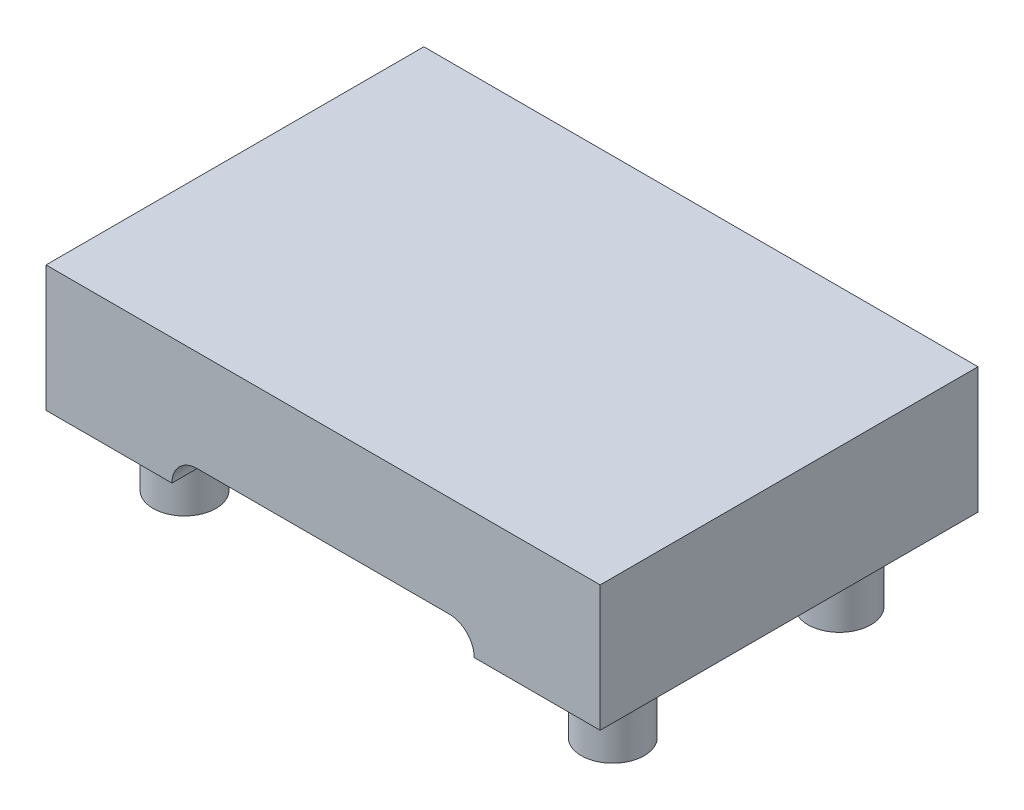
ISO-10303-21;
HEADER;
FILE_DESCRIPTION(('STEP AP214'),'2;1');
FILE_NAME('part.step','',(''),(''),'','','');
FILE_SCHEMA(('AUTOMOTIVE_DESIGN { 1 0 10303 214 1 1 1 1 }'));
ENDSEC;
DATA;
#1=APPLICATION_CONTEXT('core data for automotive mechanical design processes');
#2=APPLICATION_PROTOCOL_DEFINITION('international standard','automotive_design',2000,#1);
#3=PRODUCT_CONTEXT('',#1,'mechanical');
#4=PRODUCT('Part','Part','',(#3));
#5=PRODUCT_RELATED_PRODUCT_CATEGORY('part','',(#4));
#6=PRODUCT_DEFINITION_FORMATION('','',#4);
#7=PRODUCT_DEFINITION_CONTEXT('part definition',#1,'design');
#8=PRODUCT_DEFINITION('design','',#6,#7);
#9=PRODUCT_DEFINITION_SHAPE('','',#8);
#10=(LENGTH_UNIT() NAMED_UNIT(*) SI_UNIT(.MILLI.,.METRE.));
#11=(NAMED_UNIT(*) PLANE_ANGLE_UNIT() SI_UNIT($,.RADIAN.));
#12=(NAMED_UNIT(*) SI_UNIT($,.STERADIAN.) SOLID_ANGLE_UNIT());
#13=UNCERTAINTY_MEASURE_WITH_UNIT(LENGTH_MEASURE(1.E-05),#10,'distance_accuracy_value','');
#14=(GEOMETRIC_REPRESENTATION_CONTEXT(3) GLOBAL_UNCERTAINTY_ASSIGNED_CONTEXT((#13)) GLOBAL_UNIT_ASSIGNED_CONTEXT((#10,
#11,#12)) REPRESENTATION_CONTEXT('',''));
#15=CARTESIAN_POINT('',(0.,0.,0.));
#16=DIRECTION('',(0.,0.,1.));
#17=DIRECTION('',(1.,0.,0.));
#18=AXIS2_PLACEMENT_3D('',#15,#16,#17);
#19=CARTESIAN_POINT('',(9.,0.,-0.00999999999999959));
#20=DIRECTION('',(0.,1.,0.));
#21=DIRECTION('',(0.,0.,1.));
#22=AXIS2_PLACEMENT_3D('',#19,#20,#21);
#23=PLANE('',#22);
#24=CARTESIAN_POINT('',(-8.5,0.,12.));
#25=DIRECTION('',(0.,1.,0.));
#26=DIRECTION('',(0.,0.,1.));
#27=AXIS2_PLACEMENT_3D('',#24,#25,#26);
#28=CIRCLE('',#27,1.25);
#29=CARTESIAN_POINT('',(-8.5,0.,13.25));
#30=VERTEX_POINT('',#29);
#31=EDGE_CURVE('E11',#30,#30,#28,.F.);
#32=ORIENTED_EDGE('',*,*,#31,.F.);
#33=EDGE_LOOP('',(#32));
#34=FACE_BOUND('',#33,.T.);
#35=CARTESIAN_POINT('',(-8.49999999999999,0.,3.));
#36=DIRECTION('',(0.,1.,0.));
#37=DIRECTION('',(0.,0.,1.));
#38=AXIS2_PLACEMENT_3D('',#35,#36,#37);
#39=CIRCLE('',#38,1.25);
#40=CARTESIAN_POINT('',(-8.49999999999999,0.,4.25));
#41=VERTEX_POINT('',#40);
#42=EDGE_CURVE('E44',#41,#41,#39,.F.);
#43=ORIENTED_EDGE('',*,*,#42,.F.);
#44=EDGE_LOOP('',(#43));
#45=FACE_BOUND('',#44,.T.);
#46=DIRECTION('',(0.,0.,-1.));
#47=VECTOR('',#46,1.);
#48=CARTESIAN_POINT('',(-6.,0.,15.));
#49=LINE('',#48,#47);
#50=CARTESIAN_POINT('',(-6.,0.,0.));
#51=VERTEX_POINT('',#50);
#52=CARTESIAN_POINT('',(-6.,0.,15.));
#53=VERTEX_POINT('',#52);
#54=EDGE_CURVE('E175',#51,#53,#49,.F.);
#55=ORIENTED_EDGE('',*,*,#54,.T.);
#56=DIRECTION('',(-1.,0.,0.));
#57=VECTOR('',#56,1.);
#58=CARTESIAN_POINT('',(0.,0.,15.));
#59=LINE('',#58,#57);
#60=CARTESIAN_POINT('',(-11.,0.,15.));
#61=VERTEX_POINT('',#60);
#62=EDGE_CURVE('E176',#53,#61,#59,.T.);
#63=ORIENTED_EDGE('',*,*,#62,.T.);
#64=DIRECTION('',(0.,0.,1.));
#65=VECTOR('',#64,1.);
#66=CARTESIAN_POINT('',(-11.,0.,0.));
#67=LINE('',#66,#65);
#68=CARTESIAN_POINT('',(-11.,0.,0.));
#69=VERTEX_POINT('',#68);
#70=EDGE_CURVE('E109',#69,#61,#67,.T.);
#71=ORIENTED_EDGE('',*,*,#70,.F.);
#72=DIRECTION('',(-1.,0.,0.));
#73=VECTOR('',#72,1.);
#74=CARTESIAN_POINT('',(0.,0.,0.));
#75=LINE('',#74,#73);
#76=EDGE_CURVE('E172',#51,#69,#75,.T.);
#77=ORIENTED_EDGE('',*,*,#76,.F.);
#78=EDGE_LOOP('',(#55,#63,#71,#77));
#79=FACE_BOUND('',#78,.T.);
#80=ADVANCED_FACE('F37',(#34,#45,#79),#23,.F.);
#81=CARTESIAN_POINT('',(8.5,0.,3.));
#82=DIRECTION('',(0.,1.,0.));
#83=DIRECTION('',(0.,0.,1.));
#84=AXIS2_PLACEMENT_3D('',#81,#82,#83);
#85=CIRCLE('',#84,1.25);
#86=CARTESIAN_POINT('',(8.5,0.,4.25));
#87=VERTEX_POINT('',#86);
#88=EDGE_CURVE('E184',#87,#87,#85,.F.);
#89=ORIENTED_EDGE('',*,*,#88,.F.);
#90=EDGE_LOOP('',(#89));
#91=FACE_BOUND('',#90,.T.);
#92=CARTESIAN_POINT('',(8.5,0.,12.));
#93=DIRECTION('',(0.,1.,0.));
#94=DIRECTION('',(0.,0.,1.));
#95=AXIS2_PLACEMENT_3D('',#92,#93,#94);
#96=CIRCLE('',#95,1.25);
#97=CARTESIAN_POINT('',(8.5,0.,13.25));
#98=VERTEX_POINT('',#97);
#99=EDGE_CURVE('E174',#98,#98,#96,.F.);
#100=ORIENTED_EDGE('',*,*,#99,.F.);
#101=EDGE_LOOP('',(#100));
#102=FACE_BOUND('',#101,.T.);
#103=CARTESIAN_POINT('',(11.,0.,0.));
#104=VERTEX_POINT('',#103);
#105=CARTESIAN_POINT('',(6.,0.,0.));
#106=VERTEX_POINT('',#105);
#107=EDGE_CURVE('E51',#104,#106,#75,.T.);
#108=ORIENTED_EDGE('',*,*,#107,.F.);
#109=DIRECTION('',(0.,0.,-1.));
#110=VECTOR('',#109,1.);
#111=CARTESIAN_POINT('',(11.,0.,15.));
#112=LINE('',#111,#110);
#113=CARTESIAN_POINT('',(11.,0.,15.));
#114=VERTEX_POINT('',#113);
#115=EDGE_CURVE('E146',#114,#104,#112,.T.);
#116=ORIENTED_EDGE('',*,*,#115,.F.);
#117=CARTESIAN_POINT('',(6.,0.,15.));
#118=VERTEX_POINT('',#117);
#119=EDGE_CURVE('E178',#114,#118,#59,.T.);
#120=ORIENTED_EDGE('',*,*,#119,.T.);
#121=DIRECTION('',(0.,0.,-1.));
#122=VECTOR('',#121,1.);
#123=CARTESIAN_POINT('',(6.,0.,15.));
#124=LINE('',#123,#122);
#125=EDGE_CURVE('E58',#118,#106,#124,.T.);
#126=ORIENTED_EDGE('',*,*,#125,.T.);
#127=EDGE_LOOP('',(#108,#116,#120,#126));
#128=FACE_BOUND('',#127,.T.);
#129=ADVANCED_FACE('F193',(#91,#102,#128),#23,.F.);
#130=CARTESIAN_POINT('',(0.,0.,15.));
#131=DIRECTION('',(0.,0.,1.));
#132=DIRECTION('',(1.,0.,0.));
#133=AXIS2_PLACEMENT_3D('',#130,#131,#132);
#134=PLANE('',#133);
#135=ORIENTED_EDGE('',*,*,#119,.F.);
#136=DIRECTION('',(0.,-1.,0.));
#137=VECTOR('',#136,1.);
#138=CARTESIAN_POINT('',(11.,2.,15.));
#139=LINE('',#138,#137);
#140=CARTESIAN_POINT('',(11.,5.,15.));
#141=VERTEX_POINT('',#140);
#142=EDGE_CURVE('E111',#141,#114,#139,.T.);
#143=ORIENTED_EDGE('',*,*,#142,.F.);
#144=DIRECTION('',(1.,0.,0.));
#145=VECTOR('',#144,1.);
#146=CARTESIAN_POINT('',(-11.,5.,15.));
#147=LINE('',#146,#145);
#148=CARTESIAN_POINT('',(-11.,5.,15.));
#149=VERTEX_POINT('',#148);
#150=EDGE_CURVE('E114',#149,#141,#147,.T.);
#151=ORIENTED_EDGE('',*,*,#150,.F.);
#152=DIRECTION('',(0.,1.,0.));
#153=VECTOR('',#152,1.);
#154=CARTESIAN_POINT('',(-11.,2.,15.));
#155=LINE('',#154,#153);
#156=EDGE_CURVE('E102',#61,#149,#155,.T.);
#157=ORIENTED_EDGE('',*,*,#156,.F.);
#158=ORIENTED_EDGE('',*,*,#62,.F.);
#159=CARTESIAN_POINT('',(-5.,0.,15.));
#160=DIRECTION('',(0.,0.,1.));
#161=DIRECTION('',(1.,0.,0.));
#162=AXIS2_PLACEMENT_3D('',#159,#160,#161);
#163=CIRCLE('',#162,1.);
#164=CARTESIAN_POINT('',(-5.,1.,15.));
#165=VERTEX_POINT('',#164);
#166=EDGE_CURVE('E152',#165,#53,#163,.T.);
#167=ORIENTED_EDGE('',*,*,#166,.F.);
#168=DIRECTION('',(-1.,0.,0.));
#169=VECTOR('',#168,1.);
#170=CARTESIAN_POINT('',(-5.,1.,15.));
#171=LINE('',#170,#169);
#172=CARTESIAN_POINT('',(5.,1.,15.));
#173=VERTEX_POINT('',#172);
#174=EDGE_CURVE('E158',#173,#165,#171,.T.);
#175=ORIENTED_EDGE('',*,*,#174,.F.);
#176=CARTESIAN_POINT('',(5.,0.,15.));
#177=DIRECTION('',(0.,0.,1.));
#178=DIRECTION('',(1.,0.,0.));
#179=AXIS2_PLACEMENT_3D('',#176,#177,#178);
#180=CIRCLE('',#179,1.);
#181=EDGE_CURVE('E155',#118,#173,#180,.T.);
#182=ORIENTED_EDGE('',*,*,#181,.F.);
#183=EDGE_LOOP('',(#135,#143,#151,#157,#158,#167,#175,#182));
#184=FACE_BOUND('',#183,.T.);
#185=ADVANCED_FACE('F115',(#184),#134,.T.);
#186=CARTESIAN_POINT('',(0.,0.,0.));
#187=DIRECTION('',(0.,0.,1.));
#188=DIRECTION('',(1.,0.,0.));
#189=AXIS2_PLACEMENT_3D('',#186,#187,#188);
#190=PLANE('',#189);
#191=DIRECTION('',(0.,-1.,0.));
#192=VECTOR('',#191,1.);
#193=CARTESIAN_POINT('',(-11.,2.,0.));
#194=LINE('',#193,#192);
#195=CARTESIAN_POINT('',(-11.,5.,0.));
#196=VERTEX_POINT('',#195);
#197=EDGE_CURVE('E142',#196,#69,#194,.T.);
#198=ORIENTED_EDGE('',*,*,#197,.F.);
#199=DIRECTION('',(-1.,0.,0.));
#200=VECTOR('',#199,1.);
#201=CARTESIAN_POINT('',(-11.,5.,0.));
#202=LINE('',#201,#200);
#203=CARTESIAN_POINT('',(11.,5.,0.));
#204=VERTEX_POINT('',#203);
#205=EDGE_CURVE('E125',#204,#196,#202,.T.);
#206=ORIENTED_EDGE('',*,*,#205,.F.);
#207=DIRECTION('',(0.,1.,0.));
#208=VECTOR('',#207,1.);
#209=CARTESIAN_POINT('',(11.,2.,0.));
#210=LINE('',#209,#208);
#211=EDGE_CURVE('E149',#104,#204,#210,.T.);
#212=ORIENTED_EDGE('',*,*,#211,.F.);
#213=ORIENTED_EDGE('',*,*,#107,.T.);
#214=CARTESIAN_POINT('',(5.,0.,0.));
#215=DIRECTION('',(0.,0.,1.));
#216=DIRECTION('',(1.,0.,0.));
#217=AXIS2_PLACEMENT_3D('',#214,#215,#216);
#218=CIRCLE('',#217,1.);
#219=CARTESIAN_POINT('',(5.,1.,0.));
#220=VERTEX_POINT('',#219);
#221=EDGE_CURVE('E163',#106,#220,#218,.T.);
#222=ORIENTED_EDGE('',*,*,#221,.T.);
#223=DIRECTION('',(-1.,0.,0.));
#224=VECTOR('',#223,1.);
#225=CARTESIAN_POINT('',(-5.,1.,0.));
#226=LINE('',#225,#224);
#227=CARTESIAN_POINT('',(-5.,1.,0.));
#228=VERTEX_POINT('',#227);
#229=EDGE_CURVE('E156',#220,#228,#226,.T.);
#230=ORIENTED_EDGE('',*,*,#229,.T.);
#231=CARTESIAN_POINT('',(-5.,0.,0.));
#232=DIRECTION('',(0.,0.,1.));
#233=DIRECTION('',(1.,0.,0.));
#234=AXIS2_PLACEMENT_3D('',#231,#232,#233);
#235=CIRCLE('',#234,1.);
#236=EDGE_CURVE('E151',#228,#51,#235,.T.);
#237=ORIENTED_EDGE('',*,*,#236,.T.);
#238=ORIENTED_EDGE('',*,*,#76,.T.);
#239=EDGE_LOOP('',(#198,#206,#212,#213,#222,#230,#237,#238));
#240=FACE_BOUND('',#239,.T.);
#241=ADVANCED_FACE('F207',(#240),#190,.F.);
#242=CARTESIAN_POINT('',(-5.,0.,15.));
#243=DIRECTION('',(0.,0.,-1.));
#244=DIRECTION('',(-1.,0.,0.));
#245=AXIS2_PLACEMENT_3D('',#242,#243,#244);
#246=CYLINDRICAL_SURFACE('',#245,1.);
#247=ORIENTED_EDGE('',*,*,#54,.F.);
#248=ORIENTED_EDGE('',*,*,#236,.F.);
#249=DIRECTION('',(0.,0.,-1.));
#250=VECTOR('',#249,1.);
#251=CARTESIAN_POINT('',(-5.,1.,15.));
#252=LINE('',#251,#250);
#253=EDGE_CURVE('E160',#165,#228,#252,.T.);
#254=ORIENTED_EDGE('',*,*,#253,.F.);
#255=ORIENTED_EDGE('',*,*,#166,.T.);
#256=EDGE_LOOP('',(#247,#248,#254,#255));
#257=FACE_BOUND('',#256,.T.);
#258=ADVANCED_FACE('F199',(#257),#246,.F.);
#259=CARTESIAN_POINT('',(5.,0.,15.));
#260=DIRECTION('',(0.,0.,-1.));
#261=DIRECTION('',(-1.,0.,0.));
#262=AXIS2_PLACEMENT_3D('',#259,#260,#261);
#263=CYLINDRICAL_SURFACE('',#262,1.);
#264=ORIENTED_EDGE('',*,*,#125,.F.);
#265=ORIENTED_EDGE('',*,*,#181,.T.);
#266=DIRECTION('',(0.,0.,-1.));
#267=VECTOR('',#266,1.);
#268=CARTESIAN_POINT('',(5.,1.,15.));
#269=LINE('',#268,#267);
#270=EDGE_CURVE('E169',#173,#220,#269,.T.);
#271=ORIENTED_EDGE('',*,*,#270,.T.);
#272=ORIENTED_EDGE('',*,*,#221,.F.);
#273=EDGE_LOOP('',(#264,#265,#271,#272));
#274=FACE_BOUND('',#273,.T.);
#275=ADVANCED_FACE('F206',(#274),#263,.F.);
#276=CARTESIAN_POINT('',(-5.,1.,15.));
#277=DIRECTION('',(0.,-1.,0.));
#278=DIRECTION('',(1.,0.,0.));
#279=AXIS2_PLACEMENT_3D('',#276,#277,#278);
#280=PLANE('',#279);
#281=ORIENTED_EDGE('',*,*,#229,.F.);
#282=ORIENTED_EDGE('',*,*,#270,.F.);
#283=ORIENTED_EDGE('',*,*,#174,.T.);
#284=ORIENTED_EDGE('',*,*,#253,.T.);
#285=EDGE_LOOP('',(#281,#282,#283,#284));
#286=FACE_BOUND('',#285,.T.);
#287=ADVANCED_FACE('F205',(#286),#280,.T.);
#288=CARTESIAN_POINT('',(11.,0.,0.));
#289=DIRECTION('',(1.,0.,0.));
#290=DIRECTION('',(0.,0.,-1.));
#291=AXIS2_PLACEMENT_3D('',#288,#289,#290);
#292=PLANE('',#291);
#293=ORIENTED_EDGE('',*,*,#142,.T.);
#294=ORIENTED_EDGE('',*,*,#115,.T.);
#295=ORIENTED_EDGE('',*,*,#211,.T.);
#296=DIRECTION('',(0.,0.,-1.));
#297=VECTOR('',#296,1.);
#298=CARTESIAN_POINT('',(11.,5.,0.));
#299=LINE('',#298,#297);
#300=EDGE_CURVE('E120',#141,#204,#299,.T.);
#301=ORIENTED_EDGE('',*,*,#300,.F.);
#302=EDGE_LOOP('',(#293,#294,#295,#301));
#303=FACE_BOUND('',#302,.T.);
#304=ADVANCED_FACE('F209',(#303),#292,.T.);
#305=CARTESIAN_POINT('',(-11.,0.,0.));
#306=DIRECTION('',(-1.,0.,0.));
#307=DIRECTION('',(0.,0.,1.));
#308=AXIS2_PLACEMENT_3D('',#305,#306,#307);
#309=PLANE('',#308);
#310=ORIENTED_EDGE('',*,*,#197,.T.);
#311=ORIENTED_EDGE('',*,*,#70,.T.);
#312=ORIENTED_EDGE('',*,*,#156,.T.);
#313=DIRECTION('',(0.,0.,1.));
#314=VECTOR('',#313,1.);
#315=CARTESIAN_POINT('',(-11.,5.,0.));
#316=LINE('',#315,#314);
#317=EDGE_CURVE('E107',#196,#149,#316,.T.);
#318=ORIENTED_EDGE('',*,*,#317,.F.);
#319=EDGE_LOOP('',(#310,#311,#312,#318));
#320=FACE_BOUND('',#319,.T.);
#321=ADVANCED_FACE('F105',(#320),#309,.T.);
#322=CARTESIAN_POINT('',(8.5,-3.,12.));
#323=DIRECTION('',(0.,1.,0.));
#324=DIRECTION('',(0.,0.,1.));
#325=AXIS2_PLACEMENT_3D('',#322,#323,#324);
#326=CYLINDRICAL_SURFACE('',#325,1.25);
#327=CARTESIAN_POINT('',(8.5,-3.,12.));
#328=DIRECTION('',(0.,-1.,0.));
#329=DIRECTION('',(0.,0.,-1.));
#330=AXIS2_PLACEMENT_3D('',#327,#328,#329);
#331=CIRCLE('',#330,1.25);
#332=CARTESIAN_POINT('',(8.5,-3.,10.75));
#333=VERTEX_POINT('',#332);
#334=EDGE_CURVE('E139',#333,#333,#331,.T.);
#335=ORIENTED_EDGE('',*,*,#334,.F.);
#336=EDGE_LOOP('',(#335));
#337=FACE_BOUND('',#336,.T.);
#338=ORIENTED_EDGE('',*,*,#99,.T.);
#339=EDGE_LOOP('',(#338));
#340=FACE_BOUND('',#339,.T.);
#341=ADVANCED_FACE('F266',(#337,#340),#326,.T.);
#342=CARTESIAN_POINT('',(8.5,-3.,12.));
#343=DIRECTION('',(0.,-1.,0.));
#344=DIRECTION('',(0.,0.,-1.));
#345=AXIS2_PLACEMENT_3D('',#342,#343,#344);
#346=PLANE('',#345);
#347=ORIENTED_EDGE('',*,*,#334,.T.);
#348=EDGE_LOOP('',(#347));
#349=FACE_BOUND('',#348,.T.);
#350=ADVANCED_FACE('F271',(#349),#346,.T.);
#351=CARTESIAN_POINT('',(8.5,-3.,3.));
#352=DIRECTION('',(0.,1.,0.));
#353=DIRECTION('',(0.,0.,1.));
#354=AXIS2_PLACEMENT_3D('',#351,#352,#353);
#355=CYLINDRICAL_SURFACE('',#354,1.25);
#356=CARTESIAN_POINT('',(8.5,-3.,3.));
#357=DIRECTION('',(0.,-1.,0.));
#358=DIRECTION('',(0.,0.,-1.));
#359=AXIS2_PLACEMENT_3D('',#356,#357,#358);
#360=CIRCLE('',#359,1.25);
#361=CARTESIAN_POINT('',(8.5,-3.,1.75));
#362=VERTEX_POINT('',#361);
#363=EDGE_CURVE('E136',#362,#362,#360,.T.);
#364=ORIENTED_EDGE('',*,*,#363,.F.);
#365=EDGE_LOOP('',(#364));
#366=FACE_BOUND('',#365,.T.);
#367=ORIENTED_EDGE('',*,*,#88,.T.);
#368=EDGE_LOOP('',(#367));
#369=FACE_BOUND('',#368,.T.);
#370=ADVANCED_FACE('F283',(#366,#369),#355,.T.);
#371=CARTESIAN_POINT('',(8.5,-3.,3.));
#372=DIRECTION('',(0.,-1.,0.));
#373=DIRECTION('',(0.,0.,-1.));
#374=AXIS2_PLACEMENT_3D('',#371,#372,#373);
#375=PLANE('',#374);
#376=ORIENTED_EDGE('',*,*,#363,.T.);
#377=EDGE_LOOP('',(#376));
#378=FACE_BOUND('',#377,.T.);
#379=ADVANCED_FACE('F293',(#378),#375,.T.);
#380=CARTESIAN_POINT('',(-8.49999999999999,-3.,3.));
#381=DIRECTION('',(0.,1.,0.));
#382=DIRECTION('',(0.,0.,1.));
#383=AXIS2_PLACEMENT_3D('',#380,#381,#382);
#384=CYLINDRICAL_SURFACE('',#383,1.25);
#385=CARTESIAN_POINT('',(-8.49999999999999,-3.,3.));
#386=DIRECTION('',(0.,-1.,0.));
#387=DIRECTION('',(0.,0.,1.));
#388=AXIS2_PLACEMENT_3D('',#385,#386,#387);
#389=CIRCLE('',#388,1.25);
#390=CARTESIAN_POINT('',(-8.49999999999999,-3.,4.25));
#391=VERTEX_POINT('',#390);
#392=EDGE_CURVE('E133',#391,#391,#389,.T.);
#393=ORIENTED_EDGE('',*,*,#392,.F.);
#394=EDGE_LOOP('',(#393));
#395=FACE_BOUND('',#394,.T.);
#396=ORIENTED_EDGE('',*,*,#42,.T.);
#397=EDGE_LOOP('',(#396));
#398=FACE_BOUND('',#397,.T.);
#399=ADVANCED_FACE('F189',(#395,#398),#384,.T.);
#400=CARTESIAN_POINT('',(-8.49999999999999,-3.,3.));
#401=DIRECTION('',(0.,1.,0.));
#402=DIRECTION('',(0.,0.,1.));
#403=AXIS2_PLACEMENT_3D('',#400,#401,#402);
#404=PLANE('',#403);
#405=ORIENTED_EDGE('',*,*,#392,.T.);
#406=EDGE_LOOP('',(#405));
#407=FACE_BOUND('',#406,.T.);
#408=ADVANCED_FACE('F312',(#407),#404,.F.);
#409=CARTESIAN_POINT('',(-8.5,-3.,12.));
#410=DIRECTION('',(0.,1.,0.));
#411=DIRECTION('',(0.,0.,1.));
#412=AXIS2_PLACEMENT_3D('',#409,#410,#411);
#413=CYLINDRICAL_SURFACE('',#412,1.25);
#414=CARTESIAN_POINT('',(-8.5,-3.,12.));
#415=DIRECTION('',(0.,-1.,0.));
#416=DIRECTION('',(0.,0.,1.));
#417=AXIS2_PLACEMENT_3D('',#414,#415,#416);
#418=CIRCLE('',#417,1.25);
#419=CARTESIAN_POINT('',(-8.5,-3.,13.25));
#420=VERTEX_POINT('',#419);
#421=EDGE_CURVE('E130',#420,#420,#418,.T.);
#422=ORIENTED_EDGE('',*,*,#421,.F.);
#423=EDGE_LOOP('',(#422));
#424=FACE_BOUND('',#423,.T.);
#425=ORIENTED_EDGE('',*,*,#31,.T.);
#426=EDGE_LOOP('',(#425));
#427=FACE_BOUND('',#426,.T.);
#428=ADVANCED_FACE('F322',(#424,#427),#413,.T.);
#429=CARTESIAN_POINT('',(-8.5,-3.,12.));
#430=DIRECTION('',(0.,1.,0.));
#431=DIRECTION('',(0.,0.,1.));
#432=AXIS2_PLACEMENT_3D('',#429,#430,#431);
#433=PLANE('',#432);
#434=ORIENTED_EDGE('',*,*,#421,.T.);
#435=EDGE_LOOP('',(#434));
#436=FACE_BOUND('',#435,.T.);
#437=ADVANCED_FACE('F332',(#436),#433,.F.);
#438=CARTESIAN_POINT('',(0.,5.,0.));
#439=DIRECTION('',(0.,1.,0.));
#440=DIRECTION('',(0.,0.,1.));
#441=AXIS2_PLACEMENT_3D('',#438,#439,#440);
#442=PLANE('',#441);
#443=ORIENTED_EDGE('',*,*,#317,.T.);
#444=ORIENTED_EDGE('',*,*,#150,.T.);
#445=ORIENTED_EDGE('',*,*,#300,.T.);
#446=ORIENTED_EDGE('',*,*,#205,.T.);
#447=EDGE_LOOP('',(#443,#444,#445,#446));
#448=FACE_BOUND('',#447,.T.);
#449=ADVANCED_FACE('F123',(#448),#442,.T.);
#450=CLOSED_SHELL('',(#80,#129,#185,#241,#258,#275,#287,#304,#321,#341,#350,#370,#379,#399,#408,
#428,#437,#449));
#451=MANIFOLD_SOLID_BREP('B2',#450);
#452=ADVANCED_BREP_SHAPE_REPRESENTATION('',(#18,#451),#14);
#453=SHAPE_DEFINITION_REPRESENTATION(#9,#452);
ENDSEC;
END-ISO-10303-21;
